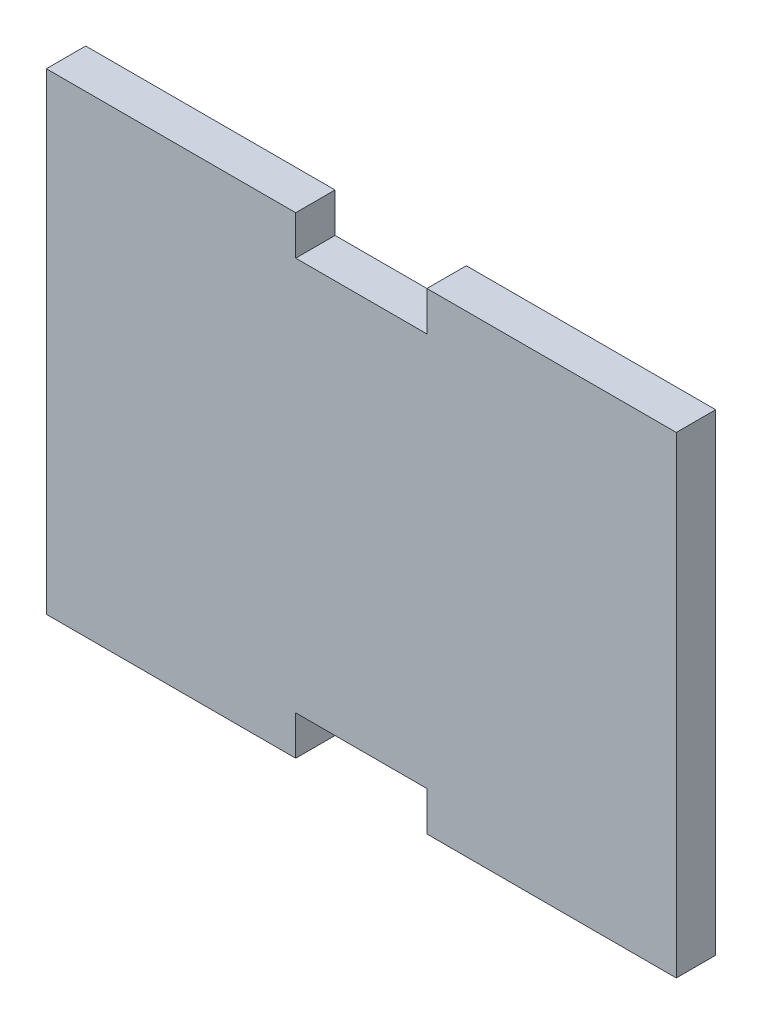
ISO-10303-21;
HEADER;
FILE_DESCRIPTION(('STEP AP214'),'2;1');
FILE_NAME('part.step','',(''),(''),'','','');
FILE_SCHEMA(('AUTOMOTIVE_DESIGN { 1 0 10303 214 1 1 1 1 }'));
ENDSEC;
DATA;
#1=APPLICATION_CONTEXT('core data for automotive mechanical design processes');
#2=APPLICATION_PROTOCOL_DEFINITION('international standard','automotive_design',2000,#1);
#3=PRODUCT_CONTEXT('',#1,'mechanical');
#4=PRODUCT('Part','Part','',(#3));
#5=PRODUCT_RELATED_PRODUCT_CATEGORY('part','',(#4));
#6=PRODUCT_DEFINITION_FORMATION('','',#4);
#7=PRODUCT_DEFINITION_CONTEXT('part definition',#1,'design');
#8=PRODUCT_DEFINITION('design','',#6,#7);
#9=PRODUCT_DEFINITION_SHAPE('','',#8);
#10=(LENGTH_UNIT() NAMED_UNIT(*) SI_UNIT(.MILLI.,.METRE.));
#11=(NAMED_UNIT(*) PLANE_ANGLE_UNIT() SI_UNIT($,.RADIAN.));
#12=(NAMED_UNIT(*) SI_UNIT($,.STERADIAN.) SOLID_ANGLE_UNIT());
#13=UNCERTAINTY_MEASURE_WITH_UNIT(LENGTH_MEASURE(1.E-05),#10,'distance_accuracy_value','');
#14=(GEOMETRIC_REPRESENTATION_CONTEXT(3) GLOBAL_UNCERTAINTY_ASSIGNED_CONTEXT((#13)) GLOBAL_UNIT_ASSIGNED_CONTEXT((#10,
#11,#12)) REPRESENTATION_CONTEXT('',''));
#15=CARTESIAN_POINT('',(0.,0.,0.));
#16=DIRECTION('',(0.,0.,1.));
#17=DIRECTION('',(1.,0.,0.));
#18=AXIS2_PLACEMENT_3D('',#15,#16,#17);
#19=CARTESIAN_POINT('',(-13.6279069767442,7.15116279069768,3.));
#20=DIRECTION('',(0.,1.,0.));
#21=DIRECTION('',(-1.,0.,0.));
#22=AXIS2_PLACEMENT_3D('',#19,#20,#21);
#23=PLANE('',#22);
#24=DIRECTION('',(1.,0.,0.));
#25=VECTOR('',#24,1.);
#26=CARTESIAN_POINT('',(-13.6279069767442,7.15116279069768,0.));
#27=LINE('',#26,#25);
#28=CARTESIAN_POINT('',(-13.6279069767442,7.15116279069768,0.));
#29=VERTEX_POINT('',#28);
#30=CARTESIAN_POINT('',(5.37209302325583,7.15116279069767,0.));
#31=VERTEX_POINT('',#30);
#32=EDGE_CURVE('E156',#29,#31,#27,.T.);
#33=ORIENTED_EDGE('',*,*,#32,.T.);
#34=DIRECTION('',(0.,0.,-1.));
#35=VECTOR('',#34,1.);
#36=CARTESIAN_POINT('',(5.37209302325583,7.15116279069767,3.));
#37=LINE('',#36,#35);
#38=CARTESIAN_POINT('',(5.37209302325583,7.15116279069767,3.));
#39=VERTEX_POINT('',#38);
#40=EDGE_CURVE('E11',#39,#31,#37,.T.);
#41=ORIENTED_EDGE('',*,*,#40,.F.);
#42=DIRECTION('',(1.,0.,0.));
#43=VECTOR('',#42,1.);
#44=CARTESIAN_POINT('',(-13.6279069767442,7.15116279069768,3.));
#45=LINE('',#44,#43);
#46=CARTESIAN_POINT('',(-13.6279069767442,7.15116279069768,3.));
#47=VERTEX_POINT('',#46);
#48=EDGE_CURVE('E178',#47,#39,#45,.T.);
#49=ORIENTED_EDGE('',*,*,#48,.F.);
#50=DIRECTION('',(0.,0.,-1.));
#51=VECTOR('',#50,1.);
#52=CARTESIAN_POINT('',(-13.6279069767442,7.15116279069768,3.));
#53=LINE('',#52,#51);
#54=EDGE_CURVE('E152',#47,#29,#53,.T.);
#55=ORIENTED_EDGE('',*,*,#54,.T.);
#56=EDGE_LOOP('',(#33,#41,#49,#55));
#57=FACE_BOUND('',#56,.T.);
#58=ADVANCED_FACE('F36',(#57),#23,.F.);
#59=CARTESIAN_POINT('',(5.37209302325582,43.1511627906977,3.));
#60=DIRECTION('',(-1.,0.,0.));
#61=DIRECTION('',(0.,-1.,0.));
#62=AXIS2_PLACEMENT_3D('',#59,#60,#61);
#63=PLANE('',#62);
#64=DIRECTION('',(0.,1.,0.));
#65=VECTOR('',#64,1.);
#66=CARTESIAN_POINT('',(5.37209302325582,43.1511627906977,0.));
#67=LINE('',#66,#65);
#68=CARTESIAN_POINT('',(5.37209302325582,43.1511627906977,0.));
#69=VERTEX_POINT('',#68);
#70=EDGE_CURVE('E159',#31,#69,#67,.T.);
#71=ORIENTED_EDGE('',*,*,#70,.T.);
#72=DIRECTION('',(0.,0.,-1.));
#73=VECTOR('',#72,1.);
#74=CARTESIAN_POINT('',(5.37209302325582,43.1511627906977,3.));
#75=LINE('',#74,#73);
#76=CARTESIAN_POINT('',(5.37209302325582,43.1511627906977,3.));
#77=VERTEX_POINT('',#76);
#78=EDGE_CURVE('E44',#77,#69,#75,.T.);
#79=ORIENTED_EDGE('',*,*,#78,.F.);
#80=DIRECTION('',(0.,1.,0.));
#81=VECTOR('',#80,1.);
#82=CARTESIAN_POINT('',(5.37209302325582,43.1511627906977,3.));
#83=LINE('',#82,#81);
#84=EDGE_CURVE('E107',#39,#77,#83,.T.);
#85=ORIENTED_EDGE('',*,*,#84,.F.);
#86=ORIENTED_EDGE('',*,*,#40,.T.);
#87=EDGE_LOOP('',(#71,#79,#85,#86));
#88=FACE_BOUND('',#87,.T.);
#89=ADVANCED_FACE('F256',(#88),#63,.F.);
#90=CARTESIAN_POINT('',(-13.6279069767442,43.1511627906977,3.));
#91=DIRECTION('',(0.,-1.,0.));
#92=DIRECTION('',(0.,0.,-1.));
#93=AXIS2_PLACEMENT_3D('',#90,#91,#92);
#94=PLANE('',#93);
#95=DIRECTION('',(-1.,0.,0.));
#96=VECTOR('',#95,1.);
#97=CARTESIAN_POINT('',(-13.6279069767442,43.1511627906977,0.));
#98=LINE('',#97,#96);
#99=CARTESIAN_POINT('',(-13.6279069767442,43.1511627906977,0.));
#100=VERTEX_POINT('',#99);
#101=EDGE_CURVE('E161',#69,#100,#98,.T.);
#102=ORIENTED_EDGE('',*,*,#101,.T.);
#103=DIRECTION('',(0.,0.,-1.));
#104=VECTOR('',#103,1.);
#105=CARTESIAN_POINT('',(-13.6279069767442,43.1511627906977,3.));
#106=LINE('',#105,#104);
#107=CARTESIAN_POINT('',(-13.6279069767442,43.1511627906977,3.));
#108=VERTEX_POINT('',#107);
#109=EDGE_CURVE('E197',#108,#100,#106,.T.);
#110=ORIENTED_EDGE('',*,*,#109,.F.);
#111=DIRECTION('',(-1.,0.,0.));
#112=VECTOR('',#111,1.);
#113=CARTESIAN_POINT('',(-13.6279069767442,43.1511627906977,3.));
#114=LINE('',#113,#112);
#115=EDGE_CURVE('E205',#77,#108,#114,.T.);
#116=ORIENTED_EDGE('',*,*,#115,.F.);
#117=ORIENTED_EDGE('',*,*,#78,.T.);
#118=EDGE_LOOP('',(#102,#110,#116,#117));
#119=FACE_BOUND('',#118,.T.);
#120=ADVANCED_FACE('F203',(#119),#94,.F.);
#121=CARTESIAN_POINT('',(-13.6279069767442,40.1511627906977,3.));
#122=DIRECTION('',(1.,0.,0.));
#123=DIRECTION('',(0.,0.,-1.));
#124=AXIS2_PLACEMENT_3D('',#121,#122,#123);
#125=PLANE('',#124);
#126=DIRECTION('',(0.,-1.,0.));
#127=VECTOR('',#126,1.);
#128=CARTESIAN_POINT('',(-13.6279069767442,40.1511627906977,0.));
#129=LINE('',#128,#127);
#130=CARTESIAN_POINT('',(-13.6279069767442,40.1511627906977,0.));
#131=VERTEX_POINT('',#130);
#132=EDGE_CURVE('E163',#100,#131,#129,.T.);
#133=ORIENTED_EDGE('',*,*,#132,.T.);
#134=DIRECTION('',(0.,0.,-1.));
#135=VECTOR('',#134,1.);
#136=CARTESIAN_POINT('',(-13.6279069767442,40.1511627906977,3.));
#137=LINE('',#136,#135);
#138=CARTESIAN_POINT('',(-13.6279069767442,40.1511627906977,3.));
#139=VERTEX_POINT('',#138);
#140=EDGE_CURVE('E194',#139,#131,#137,.T.);
#141=ORIENTED_EDGE('',*,*,#140,.F.);
#142=DIRECTION('',(0.,-1.,0.));
#143=VECTOR('',#142,1.);
#144=CARTESIAN_POINT('',(-13.6279069767442,40.1511627906977,3.));
#145=LINE('',#144,#143);
#146=EDGE_CURVE('E223',#108,#139,#145,.T.);
#147=ORIENTED_EDGE('',*,*,#146,.F.);
#148=ORIENTED_EDGE('',*,*,#109,.T.);
#149=EDGE_LOOP('',(#133,#141,#147,#148));
#150=FACE_BOUND('',#149,.T.);
#151=ADVANCED_FACE('F214',(#150),#125,.F.);
#152=CARTESIAN_POINT('',(-23.6279069767442,40.1511627906977,3.));
#153=DIRECTION('',(0.,-1.,0.));
#154=DIRECTION('',(0.,0.,-1.));
#155=AXIS2_PLACEMENT_3D('',#152,#153,#154);
#156=PLANE('',#155);
#157=DIRECTION('',(-1.,0.,0.));
#158=VECTOR('',#157,1.);
#159=CARTESIAN_POINT('',(-23.6279069767442,40.1511627906977,0.));
#160=LINE('',#159,#158);
#161=CARTESIAN_POINT('',(-23.6279069767442,40.1511627906977,0.));
#162=VERTEX_POINT('',#161);
#163=EDGE_CURVE('E165',#131,#162,#160,.T.);
#164=ORIENTED_EDGE('',*,*,#163,.T.);
#165=DIRECTION('',(0.,0.,-1.));
#166=VECTOR('',#165,1.);
#167=CARTESIAN_POINT('',(-23.6279069767442,40.1511627906977,3.));
#168=LINE('',#167,#166);
#169=CARTESIAN_POINT('',(-23.6279069767442,40.1511627906977,3.));
#170=VERTEX_POINT('',#169);
#171=EDGE_CURVE('E191',#170,#162,#168,.T.);
#172=ORIENTED_EDGE('',*,*,#171,.F.);
#173=DIRECTION('',(-1.,0.,0.));
#174=VECTOR('',#173,1.);
#175=CARTESIAN_POINT('',(-23.6279069767442,40.1511627906977,3.));
#176=LINE('',#175,#174);
#177=EDGE_CURVE('E220',#139,#170,#176,.T.);
#178=ORIENTED_EDGE('',*,*,#177,.F.);
#179=ORIENTED_EDGE('',*,*,#140,.T.);
#180=EDGE_LOOP('',(#164,#172,#178,#179));
#181=FACE_BOUND('',#180,.T.);
#182=ADVANCED_FACE('F218',(#181),#156,.F.);
#183=CARTESIAN_POINT('',(-23.6279069767442,43.1511627906977,3.));
#184=DIRECTION('',(-1.,0.,0.));
#185=DIRECTION('',(0.,0.,1.));
#186=AXIS2_PLACEMENT_3D('',#183,#184,#185);
#187=PLANE('',#186);
#188=DIRECTION('',(0.,1.,0.));
#189=VECTOR('',#188,1.);
#190=CARTESIAN_POINT('',(-23.6279069767442,43.1511627906977,0.));
#191=LINE('',#190,#189);
#192=CARTESIAN_POINT('',(-23.6279069767442,43.1511627906977,0.));
#193=VERTEX_POINT('',#192);
#194=EDGE_CURVE('E167',#162,#193,#191,.T.);
#195=ORIENTED_EDGE('',*,*,#194,.T.);
#196=DIRECTION('',(0.,0.,-1.));
#197=VECTOR('',#196,1.);
#198=CARTESIAN_POINT('',(-23.6279069767442,43.1511627906977,3.));
#199=LINE('',#198,#197);
#200=CARTESIAN_POINT('',(-23.6279069767442,43.1511627906977,3.));
#201=VERTEX_POINT('',#200);
#202=EDGE_CURVE('E188',#201,#193,#199,.T.);
#203=ORIENTED_EDGE('',*,*,#202,.F.);
#204=DIRECTION('',(0.,1.,0.));
#205=VECTOR('',#204,1.);
#206=CARTESIAN_POINT('',(-23.6279069767442,43.1511627906977,3.));
#207=LINE('',#206,#205);
#208=EDGE_CURVE('E222',#170,#201,#207,.T.);
#209=ORIENTED_EDGE('',*,*,#208,.F.);
#210=ORIENTED_EDGE('',*,*,#171,.T.);
#211=EDGE_LOOP('',(#195,#203,#209,#210));
#212=FACE_BOUND('',#211,.T.);
#213=ADVANCED_FACE('F269',(#212),#187,.F.);
#214=CARTESIAN_POINT('',(-42.6279069767442,43.1511627906977,3.));
#215=DIRECTION('',(0.,-1.,0.));
#216=DIRECTION('',(1.,0.,0.));
#217=AXIS2_PLACEMENT_3D('',#214,#215,#216);
#218=PLANE('',#217);
#219=DIRECTION('',(-1.,0.,0.));
#220=VECTOR('',#219,1.);
#221=CARTESIAN_POINT('',(-42.6279069767442,43.1511627906977,0.));
#222=LINE('',#221,#220);
#223=CARTESIAN_POINT('',(-42.6279069767442,43.1511627906977,0.));
#224=VERTEX_POINT('',#223);
#225=EDGE_CURVE('E169',#193,#224,#222,.T.);
#226=ORIENTED_EDGE('',*,*,#225,.T.);
#227=DIRECTION('',(0.,0.,-1.));
#228=VECTOR('',#227,1.);
#229=CARTESIAN_POINT('',(-42.6279069767442,43.1511627906977,3.));
#230=LINE('',#229,#228);
#231=CARTESIAN_POINT('',(-42.6279069767442,43.1511627906977,3.));
#232=VERTEX_POINT('',#231);
#233=EDGE_CURVE('E185',#232,#224,#230,.T.);
#234=ORIENTED_EDGE('',*,*,#233,.F.);
#235=DIRECTION('',(-1.,0.,0.));
#236=VECTOR('',#235,1.);
#237=CARTESIAN_POINT('',(-42.6279069767442,43.1511627906977,3.));
#238=LINE('',#237,#236);
#239=EDGE_CURVE('E225',#201,#232,#238,.T.);
#240=ORIENTED_EDGE('',*,*,#239,.F.);
#241=ORIENTED_EDGE('',*,*,#202,.T.);
#242=EDGE_LOOP('',(#226,#234,#240,#241));
#243=FACE_BOUND('',#242,.T.);
#244=ADVANCED_FACE('F272',(#243),#218,.F.);
#245=CARTESIAN_POINT('',(-42.6279069767442,43.1511627906977,3.));
#246=DIRECTION('',(1.,0.,0.));
#247=DIRECTION('',(0.,1.,0.));
#248=AXIS2_PLACEMENT_3D('',#245,#246,#247);
#249=PLANE('',#248);
#250=DIRECTION('',(0.,-1.,0.));
#251=VECTOR('',#250,1.);
#252=CARTESIAN_POINT('',(-42.6279069767442,43.1511627906977,0.));
#253=LINE('',#252,#251);
#254=CARTESIAN_POINT('',(-42.6279069767442,7.15116279069768,0.));
#255=VERTEX_POINT('',#254);
#256=EDGE_CURVE('E171',#224,#255,#253,.T.);
#257=ORIENTED_EDGE('',*,*,#256,.T.);
#258=DIRECTION('',(0.,0.,-1.));
#259=VECTOR('',#258,1.);
#260=CARTESIAN_POINT('',(-42.6279069767442,7.15116279069768,3.));
#261=LINE('',#260,#259);
#262=CARTESIAN_POINT('',(-42.6279069767442,7.15116279069768,3.));
#263=VERTEX_POINT('',#262);
#264=EDGE_CURVE('E182',#263,#255,#261,.T.);
#265=ORIENTED_EDGE('',*,*,#264,.F.);
#266=DIRECTION('',(0.,-1.,0.));
#267=VECTOR('',#266,1.);
#268=CARTESIAN_POINT('',(-42.6279069767442,43.1511627906977,3.));
#269=LINE('',#268,#267);
#270=EDGE_CURVE('E231',#232,#263,#269,.T.);
#271=ORIENTED_EDGE('',*,*,#270,.F.);
#272=ORIENTED_EDGE('',*,*,#233,.T.);
#273=EDGE_LOOP('',(#257,#265,#271,#272));
#274=FACE_BOUND('',#273,.T.);
#275=ADVANCED_FACE('F237',(#274),#249,.F.);
#276=CARTESIAN_POINT('',(-42.6279069767442,7.15116279069768,3.));
#277=DIRECTION('',(0.,1.,0.));
#278=DIRECTION('',(-1.,0.,0.));
#279=AXIS2_PLACEMENT_3D('',#276,#277,#278);
#280=PLANE('',#279);
#281=DIRECTION('',(1.,0.,0.));
#282=VECTOR('',#281,1.);
#283=CARTESIAN_POINT('',(-42.6279069767442,7.15116279069768,0.));
#284=LINE('',#283,#282);
#285=CARTESIAN_POINT('',(-23.6279069767442,7.15116279069768,0.));
#286=VERTEX_POINT('',#285);
#287=EDGE_CURVE('E173',#255,#286,#284,.T.);
#288=ORIENTED_EDGE('',*,*,#287,.T.);
#289=DIRECTION('',(0.,0.,-1.));
#290=VECTOR('',#289,1.);
#291=CARTESIAN_POINT('',(-23.6279069767442,7.15116279069768,3.));
#292=LINE('',#291,#290);
#293=CARTESIAN_POINT('',(-23.6279069767442,7.15116279069768,3.));
#294=VERTEX_POINT('',#293);
#295=EDGE_CURVE('E147',#294,#286,#292,.T.);
#296=ORIENTED_EDGE('',*,*,#295,.F.);
#297=DIRECTION('',(1.,0.,0.));
#298=VECTOR('',#297,1.);
#299=CARTESIAN_POINT('',(-42.6279069767442,7.15116279069768,3.));
#300=LINE('',#299,#298);
#301=EDGE_CURVE('E138',#263,#294,#300,.T.);
#302=ORIENTED_EDGE('',*,*,#301,.F.);
#303=ORIENTED_EDGE('',*,*,#264,.T.);
#304=EDGE_LOOP('',(#288,#296,#302,#303));
#305=FACE_BOUND('',#304,.T.);
#306=ADVANCED_FACE('F241',(#305),#280,.F.);
#307=CARTESIAN_POINT('',(-23.6279069767442,7.15116279069768,3.));
#308=DIRECTION('',(-1.,0.,0.));
#309=DIRECTION('',(0.,-1.,0.));
#310=AXIS2_PLACEMENT_3D('',#307,#308,#309);
#311=PLANE('',#310);
#312=DIRECTION('',(0.,1.,0.));
#313=VECTOR('',#312,1.);
#314=CARTESIAN_POINT('',(-23.6279069767442,7.15116279069768,0.));
#315=LINE('',#314,#313);
#316=CARTESIAN_POINT('',(-23.6279069767442,10.1511627906977,0.));
#317=VERTEX_POINT('',#316);
#318=EDGE_CURVE('E146',#286,#317,#315,.T.);
#319=ORIENTED_EDGE('',*,*,#318,.T.);
#320=DIRECTION('',(0.,0.,-1.));
#321=VECTOR('',#320,1.);
#322=CARTESIAN_POINT('',(-23.6279069767442,10.1511627906977,3.));
#323=LINE('',#322,#321);
#324=CARTESIAN_POINT('',(-23.6279069767442,10.1511627906977,3.));
#325=VERTEX_POINT('',#324);
#326=EDGE_CURVE('E143',#325,#317,#323,.T.);
#327=ORIENTED_EDGE('',*,*,#326,.F.);
#328=DIRECTION('',(0.,1.,0.));
#329=VECTOR('',#328,1.);
#330=CARTESIAN_POINT('',(-23.6279069767442,7.15116279069768,3.));
#331=LINE('',#330,#329);
#332=EDGE_CURVE('E132',#294,#325,#331,.T.);
#333=ORIENTED_EDGE('',*,*,#332,.F.);
#334=ORIENTED_EDGE('',*,*,#295,.T.);
#335=EDGE_LOOP('',(#319,#327,#333,#334));
#336=FACE_BOUND('',#335,.T.);
#337=ADVANCED_FACE('F144',(#336),#311,.F.);
#338=CARTESIAN_POINT('',(-23.6279069767442,10.1511627906977,3.));
#339=DIRECTION('',(0.,1.,0.));
#340=DIRECTION('',(0.,0.,1.));
#341=AXIS2_PLACEMENT_3D('',#338,#339,#340);
#342=PLANE('',#341);
#343=DIRECTION('',(1.,0.,0.));
#344=VECTOR('',#343,1.);
#345=CARTESIAN_POINT('',(-23.6279069767442,10.1511627906977,0.));
#346=LINE('',#345,#344);
#347=CARTESIAN_POINT('',(-13.6279069767442,10.1511627906977,0.));
#348=VERTEX_POINT('',#347);
#349=EDGE_CURVE('E93',#317,#348,#346,.T.);
#350=ORIENTED_EDGE('',*,*,#349,.T.);
#351=DIRECTION('',(0.,0.,-1.));
#352=VECTOR('',#351,1.);
#353=CARTESIAN_POINT('',(-13.6279069767442,10.1511627906977,3.));
#354=LINE('',#353,#352);
#355=CARTESIAN_POINT('',(-13.6279069767442,10.1511627906977,3.));
#356=VERTEX_POINT('',#355);
#357=EDGE_CURVE('E148',#356,#348,#354,.T.);
#358=ORIENTED_EDGE('',*,*,#357,.F.);
#359=DIRECTION('',(1.,0.,0.));
#360=VECTOR('',#359,1.);
#361=CARTESIAN_POINT('',(-23.6279069767442,10.1511627906977,3.));
#362=LINE('',#361,#360);
#363=EDGE_CURVE('E136',#325,#356,#362,.T.);
#364=ORIENTED_EDGE('',*,*,#363,.F.);
#365=ORIENTED_EDGE('',*,*,#326,.T.);
#366=EDGE_LOOP('',(#350,#358,#364,#365));
#367=FACE_BOUND('',#366,.T.);
#368=ADVANCED_FACE('F150',(#367),#342,.F.);
#369=CARTESIAN_POINT('',(-13.6279069767442,10.1511627906977,3.));
#370=DIRECTION('',(1.,0.,0.));
#371=DIRECTION('',(0.,1.,0.));
#372=AXIS2_PLACEMENT_3D('',#369,#370,#371);
#373=PLANE('',#372);
#374=DIRECTION('',(0.,-1.,0.));
#375=VECTOR('',#374,1.);
#376=CARTESIAN_POINT('',(-13.6279069767442,10.1511627906977,0.));
#377=LINE('',#376,#375);
#378=EDGE_CURVE('E99',#348,#29,#377,.T.);
#379=ORIENTED_EDGE('',*,*,#378,.T.);
#380=ORIENTED_EDGE('',*,*,#54,.F.);
#381=DIRECTION('',(0.,-1.,0.));
#382=VECTOR('',#381,1.);
#383=CARTESIAN_POINT('',(-13.6279069767442,10.1511627906977,3.));
#384=LINE('',#383,#382);
#385=EDGE_CURVE('E52',#356,#47,#384,.T.);
#386=ORIENTED_EDGE('',*,*,#385,.F.);
#387=ORIENTED_EDGE('',*,*,#357,.T.);
#388=EDGE_LOOP('',(#379,#380,#386,#387));
#389=FACE_BOUND('',#388,.T.);
#390=ADVANCED_FACE('F245',(#389),#373,.F.);
#391=CARTESIAN_POINT('',(0.,0.,3.));
#392=DIRECTION('',(0.,0.,-1.));
#393=DIRECTION('',(-1.,0.,0.));
#394=AXIS2_PLACEMENT_3D('',#391,#392,#393);
#395=PLANE('',#394);
#396=ORIENTED_EDGE('',*,*,#48,.T.);
#397=ORIENTED_EDGE('',*,*,#84,.T.);
#398=ORIENTED_EDGE('',*,*,#115,.T.);
#399=ORIENTED_EDGE('',*,*,#146,.T.);
#400=ORIENTED_EDGE('',*,*,#177,.T.);
#401=ORIENTED_EDGE('',*,*,#208,.T.);
#402=ORIENTED_EDGE('',*,*,#239,.T.);
#403=ORIENTED_EDGE('',*,*,#270,.T.);
#404=ORIENTED_EDGE('',*,*,#301,.T.);
#405=ORIENTED_EDGE('',*,*,#332,.T.);
#406=ORIENTED_EDGE('',*,*,#363,.T.);
#407=ORIENTED_EDGE('',*,*,#385,.T.);
#408=EDGE_LOOP('',(#396,#397,#398,#399,#400,#401,#402,#403,#404,#405,#406,#407));
#409=FACE_BOUND('',#408,.T.);
#410=ADVANCED_FACE('F134',(#409),#395,.F.);
#411=CARTESIAN_POINT('',(0.,0.,0.));
#412=DIRECTION('',(0.,0.,-1.));
#413=DIRECTION('',(-1.,0.,0.));
#414=AXIS2_PLACEMENT_3D('',#411,#412,#413);
#415=PLANE('',#414);
#416=ORIENTED_EDGE('',*,*,#32,.F.);
#417=ORIENTED_EDGE('',*,*,#378,.F.);
#418=ORIENTED_EDGE('',*,*,#349,.F.);
#419=ORIENTED_EDGE('',*,*,#318,.F.);
#420=ORIENTED_EDGE('',*,*,#287,.F.);
#421=ORIENTED_EDGE('',*,*,#256,.F.);
#422=ORIENTED_EDGE('',*,*,#225,.F.);
#423=ORIENTED_EDGE('',*,*,#194,.F.);
#424=ORIENTED_EDGE('',*,*,#163,.F.);
#425=ORIENTED_EDGE('',*,*,#132,.F.);
#426=ORIENTED_EDGE('',*,*,#101,.F.);
#427=ORIENTED_EDGE('',*,*,#70,.F.);
#428=EDGE_LOOP('',(#416,#417,#418,#419,#420,#421,#422,#423,#424,#425,#426,#427));
#429=FACE_BOUND('',#428,.T.);
#430=ADVANCED_FACE('F209',(#429),#415,.T.);
#431=CLOSED_SHELL('',(#58,#89,#120,#151,#182,#213,#244,#275,#306,#337,#368,#390,#410,#430));
#432=MANIFOLD_SOLID_BREP('B2',#431);
#433=ADVANCED_BREP_SHAPE_REPRESENTATION('',(#18,#432),#14);
#434=SHAPE_DEFINITION_REPRESENTATION(#9,#433);
ENDSEC;
END-ISO-10303-21;
